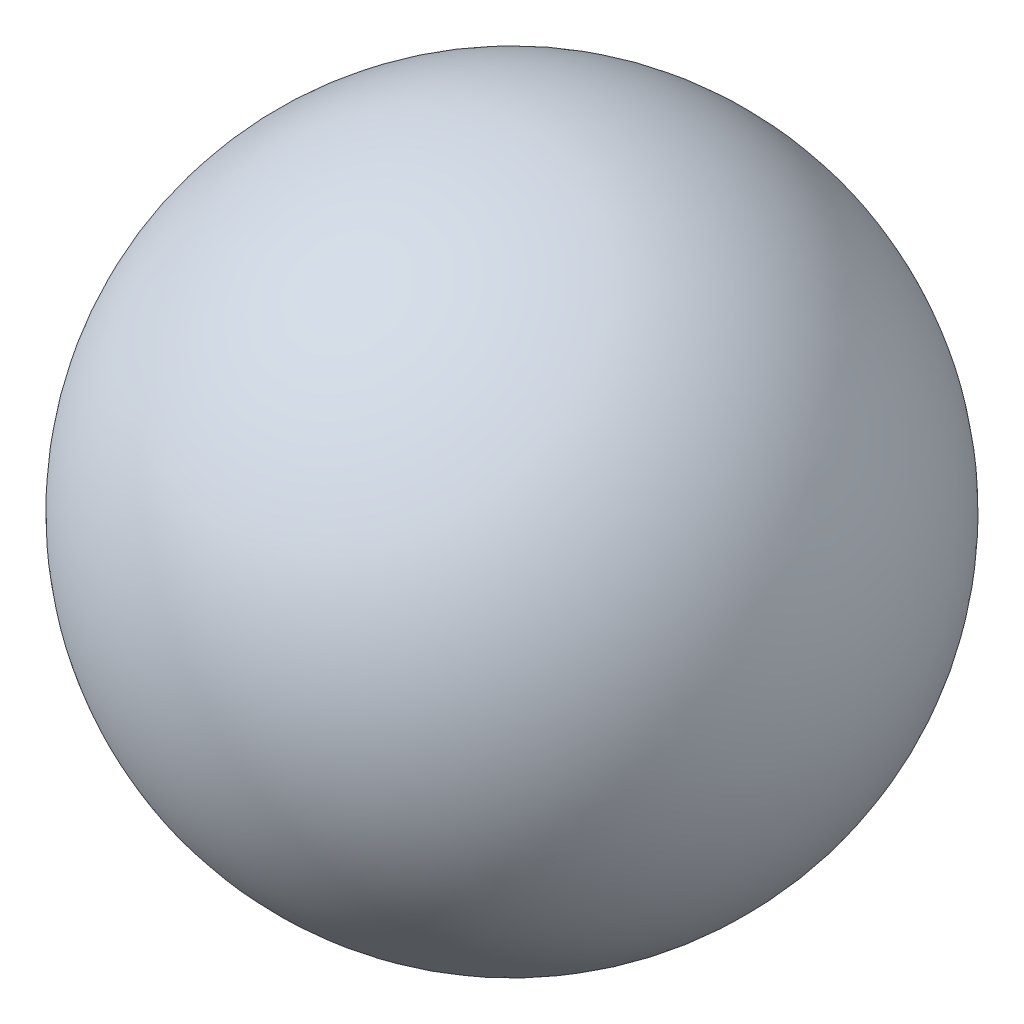
ISO-10303-21;
HEADER;
FILE_DESCRIPTION(('STEP AP214'),'2;1');
FILE_NAME('part.step','',(''),(''),'','','');
FILE_SCHEMA(('AUTOMOTIVE_DESIGN { 1 0 10303 214 1 1 1 1 }'));
ENDSEC;
DATA;
#1=APPLICATION_CONTEXT('core data for automotive mechanical design processes');
#2=APPLICATION_PROTOCOL_DEFINITION('international standard','automotive_design',2000,#1);
#3=PRODUCT_CONTEXT('',#1,'mechanical');
#4=PRODUCT('Part','Part','',(#3));
#5=PRODUCT_RELATED_PRODUCT_CATEGORY('part','',(#4));
#6=PRODUCT_DEFINITION_FORMATION('','',#4);
#7=PRODUCT_DEFINITION_CONTEXT('part definition',#1,'design');
#8=PRODUCT_DEFINITION('design','',#6,#7);
#9=PRODUCT_DEFINITION_SHAPE('','',#8);
#10=(LENGTH_UNIT() NAMED_UNIT(*) SI_UNIT(.MILLI.,.METRE.));
#11=(NAMED_UNIT(*) PLANE_ANGLE_UNIT() SI_UNIT($,.RADIAN.));
#12=(NAMED_UNIT(*) SI_UNIT($,.STERADIAN.) SOLID_ANGLE_UNIT());
#13=UNCERTAINTY_MEASURE_WITH_UNIT(LENGTH_MEASURE(1.E-05),#10,'distance_accuracy_value','');
#14=(GEOMETRIC_REPRESENTATION_CONTEXT(3) GLOBAL_UNCERTAINTY_ASSIGNED_CONTEXT((#13)) GLOBAL_UNIT_ASSIGNED_CONTEXT((#10,
#11,#12)) REPRESENTATION_CONTEXT('',''));
#15=CARTESIAN_POINT('',(0.,0.,0.));
#16=DIRECTION('',(0.,0.,1.));
#17=DIRECTION('',(1.,0.,0.));
#18=AXIS2_PLACEMENT_3D('',#15,#16,#17);
#19=CARTESIAN_POINT('',(0.,0.,0.));
#20=DIRECTION('',(0.,0.,-1.));
#21=DIRECTION('',(1.,0.,0.));
#22=AXIS2_PLACEMENT_3D('',#19,#20,#21);
#23=SPHERICAL_SURFACE('',#22,44.8699786070834);
#24=CARTESIAN_POINT('',(0.,0.,-44.8699786070834));
#25=VERTEX_POINT('',#24);
#26=VERTEX_LOOP('',#25);
#27=FACE_BOUND('',#26,.T.);
#28=ADVANCED_FACE('F29',(#27),#23,.T.);
#29=CLOSED_SHELL('',(#28));
#30=MANIFOLD_SOLID_BREP('B2',#29);
#31=ADVANCED_BREP_SHAPE_REPRESENTATION('',(#18,#30),#14);
#32=SHAPE_DEFINITION_REPRESENTATION(#9,#31);
ENDSEC;
END-ISO-10303-21;
